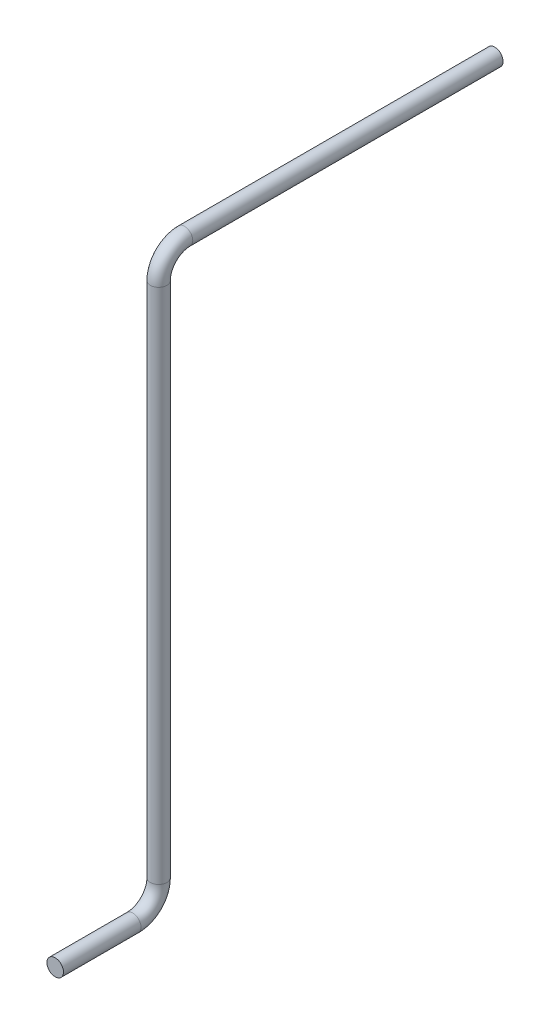
ISO-10303-21;
HEADER;
FILE_DESCRIPTION(('STEP AP214'),'2;1');
FILE_NAME('part.step','',(''),(''),'','','');
FILE_SCHEMA(('AUTOMOTIVE_DESIGN { 1 0 10303 214 1 1 1 1 }'));
ENDSEC;
DATA;
#1=APPLICATION_CONTEXT('core data for automotive mechanical design processes');
#2=APPLICATION_PROTOCOL_DEFINITION('international standard','automotive_design',2000,#1);
#3=PRODUCT_CONTEXT('',#1,'mechanical');
#4=PRODUCT('Part','Part','',(#3));
#5=PRODUCT_RELATED_PRODUCT_CATEGORY('part','',(#4));
#6=PRODUCT_DEFINITION_FORMATION('','',#4);
#7=PRODUCT_DEFINITION_CONTEXT('part definition',#1,'design');
#8=PRODUCT_DEFINITION('design','',#6,#7);
#9=PRODUCT_DEFINITION_SHAPE('','',#8);
#10=(LENGTH_UNIT() NAMED_UNIT(*) SI_UNIT(.MILLI.,.METRE.));
#11=(NAMED_UNIT(*) PLANE_ANGLE_UNIT() SI_UNIT($,.RADIAN.));
#12=(NAMED_UNIT(*) SI_UNIT($,.STERADIAN.) SOLID_ANGLE_UNIT());
#13=UNCERTAINTY_MEASURE_WITH_UNIT(LENGTH_MEASURE(1.E-05),#10,'distance_accuracy_value','');
#14=(GEOMETRIC_REPRESENTATION_CONTEXT(3) GLOBAL_UNCERTAINTY_ASSIGNED_CONTEXT((#13)) GLOBAL_UNIT_ASSIGNED_CONTEXT((#10,
#11,#12)) REPRESENTATION_CONTEXT('',''));
#15=CARTESIAN_POINT('',(0.,0.,0.));
#16=DIRECTION('',(0.,0.,1.));
#17=DIRECTION('',(1.,0.,0.));
#18=AXIS2_PLACEMENT_3D('',#15,#16,#17);
#19=CARTESIAN_POINT('',(0.,110.,-25.));
#20=DIRECTION('',(0.,0.,-1.));
#21=DIRECTION('',(-1.,0.,0.));
#22=AXIS2_PLACEMENT_3D('',#19,#20,#21);
#23=CYLINDRICAL_SURFACE('',#22,1.6);
#24=CARTESIAN_POINT('',(0.,110.,-25.));
#25=DIRECTION('',(0.,0.,1.));
#26=DIRECTION('',(1.,0.,0.));
#27=AXIS2_PLACEMENT_3D('',#24,#25,#26);
#28=CIRCLE('',#27,1.6);
#29=CARTESIAN_POINT('',(0.,111.6,-25.));
#30=VERTEX_POINT('',#29);
#31=EDGE_CURVE('E39',#30,#30,#28,.T.);
#32=ORIENTED_EDGE('',*,*,#31,.F.);
#33=EDGE_LOOP('',(#32));
#34=FACE_BOUND('',#33,.T.);
#35=CARTESIAN_POINT('',(0.,110.,-85.));
#36=DIRECTION('',(0.,0.,1.));
#37=DIRECTION('',(1.,0.,0.));
#38=AXIS2_PLACEMENT_3D('',#35,#36,#37);
#39=CIRCLE('',#38,1.6);
#40=CARTESIAN_POINT('',(1.6,110.,-85.));
#41=VERTEX_POINT('',#40);
#42=EDGE_CURVE('E10',#41,#41,#39,.T.);
#43=ORIENTED_EDGE('',*,*,#42,.T.);
#44=EDGE_LOOP('',(#43));
#45=FACE_BOUND('',#44,.T.);
#46=ADVANCED_FACE('F33',(#34,#45),#23,.T.);
#47=CARTESIAN_POINT('',(0.,105.,-25.));
#48=DIRECTION('',(-1.,0.,0.));
#49=DIRECTION('',(0.,0.,1.));
#50=AXIS2_PLACEMENT_3D('',#47,#48,#49);
#51=TOROIDAL_SURFACE('',#50,5.,1.6);
#52=CARTESIAN_POINT('',(0.,105.,-20.));
#53=DIRECTION('',(0.,-1.,0.));
#54=DIRECTION('',(1.,0.,0.));
#55=AXIS2_PLACEMENT_3D('',#52,#53,#54);
#56=CIRCLE('',#55,1.6);
#57=CARTESIAN_POINT('',(0.,105.,-18.4));
#58=VERTEX_POINT('',#57);
#59=EDGE_CURVE('E43',#58,#58,#56,.T.);
#60=CARTESIAN_POINT('',(0.,105.,-25.));
#61=DIRECTION('',(-1.,0.,0.));
#62=DIRECTION('',(0.,0.,1.));
#63=AXIS2_PLACEMENT_3D('',#60,#61,#62);
#64=CIRCLE('',#63,6.59999999999999);
#65=EDGE_CURVE('',#58,#30,#64,.T.);
#66=ORIENTED_EDGE('',*,*,#59,.F.);
#67=ORIENTED_EDGE('',*,*,#31,.T.);
#68=ORIENTED_EDGE('',*,*,#65,.T.);
#69=ORIENTED_EDGE('',*,*,#65,.F.);
#70=EDGE_LOOP('',(#66,#68,#67,#69));
#71=FACE_BOUND('',#70,.T.);
#72=ADVANCED_FACE('F71',(#71),#51,.T.);
#73=CARTESIAN_POINT('',(0.,5.,-20.));
#74=DIRECTION('',(0.,1.,0.));
#75=DIRECTION('',(0.,0.,1.));
#76=AXIS2_PLACEMENT_3D('',#73,#74,#75);
#77=CYLINDRICAL_SURFACE('',#76,1.6);
#78=CARTESIAN_POINT('',(0.,5.,-20.));
#79=DIRECTION('',(0.,-1.,0.));
#80=DIRECTION('',(1.,0.,0.));
#81=AXIS2_PLACEMENT_3D('',#78,#79,#80);
#82=CIRCLE('',#81,1.6);
#83=CARTESIAN_POINT('',(0.,5.,-21.6));
#84=VERTEX_POINT('',#83);
#85=EDGE_CURVE('E47',#84,#84,#82,.T.);
#86=ORIENTED_EDGE('',*,*,#85,.F.);
#87=EDGE_LOOP('',(#86));
#88=FACE_BOUND('',#87,.T.);
#89=ORIENTED_EDGE('',*,*,#59,.T.);
#90=EDGE_LOOP('',(#89));
#91=FACE_BOUND('',#90,.T.);
#92=ADVANCED_FACE('F65',(#88,#91),#77,.T.);
#93=CARTESIAN_POINT('',(0.,5.,-15.));
#94=DIRECTION('',(1.,0.,0.));
#95=DIRECTION('',(0.,0.,-1.));
#96=AXIS2_PLACEMENT_3D('',#93,#94,#95);
#97=TOROIDAL_SURFACE('',#96,5.,1.6);
#98=CARTESIAN_POINT('',(0.,0.,-15.));
#99=DIRECTION('',(0.,0.,1.));
#100=DIRECTION('',(1.,0.,0.));
#101=AXIS2_PLACEMENT_3D('',#98,#99,#100);
#102=CIRCLE('',#101,1.6);
#103=CARTESIAN_POINT('',(0.,-1.6,-15.));
#104=VERTEX_POINT('',#103);
#105=EDGE_CURVE('E52',#104,#104,#102,.T.);
#106=CARTESIAN_POINT('',(0.,5.,-15.));
#107=DIRECTION('',(1.,0.,0.));
#108=DIRECTION('',(0.,0.,-1.));
#109=AXIS2_PLACEMENT_3D('',#106,#107,#108);
#110=CIRCLE('',#109,6.6);
#111=EDGE_CURVE('',#104,#84,#110,.T.);
#112=ORIENTED_EDGE('',*,*,#105,.F.);
#113=ORIENTED_EDGE('',*,*,#85,.T.);
#114=ORIENTED_EDGE('',*,*,#111,.T.);
#115=ORIENTED_EDGE('',*,*,#111,.F.);
#116=EDGE_LOOP('',(#112,#114,#113,#115));
#117=FACE_BOUND('',#116,.T.);
#118=ADVANCED_FACE('F62',(#117),#97,.T.);
#119=CARTESIAN_POINT('',(0.,0.,-15.));
#120=DIRECTION('',(0.,0.,1.));
#121=DIRECTION('',(1.,0.,0.));
#122=AXIS2_PLACEMENT_3D('',#119,#120,#121);
#123=CYLINDRICAL_SURFACE('',#122,1.6);
#124=ORIENTED_EDGE('',*,*,#105,.T.);
#125=EDGE_LOOP('',(#124));
#126=FACE_BOUND('',#125,.T.);
#127=CARTESIAN_POINT('',(0.,0.,0.));
#128=DIRECTION('',(0.,0.,1.));
#129=DIRECTION('',(1.,0.,0.));
#130=AXIS2_PLACEMENT_3D('',#127,#128,#129);
#131=CIRCLE('',#130,1.6);
#132=CARTESIAN_POINT('',(1.6,0.,0.));
#133=VERTEX_POINT('',#132);
#134=EDGE_CURVE('E53',#133,#133,#131,.T.);
#135=ORIENTED_EDGE('',*,*,#134,.F.);
#136=EDGE_LOOP('',(#135));
#137=FACE_BOUND('',#136,.T.);
#138=ADVANCED_FACE('F59',(#126,#137),#123,.T.);
#139=CARTESIAN_POINT('',(0.,110.,-85.));
#140=DIRECTION('',(0.,0.,1.));
#141=DIRECTION('',(1.,0.,0.));
#142=AXIS2_PLACEMENT_3D('',#139,#140,#141);
#143=PLANE('',#142);
#144=ORIENTED_EDGE('',*,*,#42,.F.);
#145=EDGE_LOOP('',(#144));
#146=FACE_BOUND('',#145,.T.);
#147=ADVANCED_FACE('F83',(#146),#143,.F.);
#148=CARTESIAN_POINT('',(0.,0.,0.));
#149=DIRECTION('',(0.,0.,1.));
#150=DIRECTION('',(1.,0.,0.));
#151=AXIS2_PLACEMENT_3D('',#148,#149,#150);
#152=PLANE('',#151);
#153=ORIENTED_EDGE('',*,*,#134,.T.);
#154=EDGE_LOOP('',(#153));
#155=FACE_BOUND('',#154,.T.);
#156=ADVANCED_FACE('F84',(#155),#152,.T.);
#157=CLOSED_SHELL('',(#46,#72,#92,#118,#138,#147,#156));
#158=MANIFOLD_SOLID_BREP('B2',#157);
#159=ADVANCED_BREP_SHAPE_REPRESENTATION('',(#18,#158),#14);
#160=SHAPE_DEFINITION_REPRESENTATION(#9,#159);
ENDSEC;
END-ISO-10303-21;
